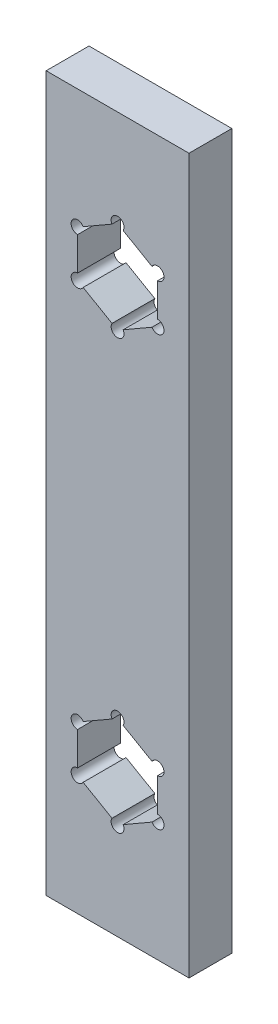
ISO-10303-21;
HEADER;
FILE_DESCRIPTION(('STEP AP214'),'2;1');
FILE_NAME('part.step','',(''),(''),'','','');
FILE_SCHEMA(('AUTOMOTIVE_DESIGN { 1 0 10303 214 1 1 1 1 }'));
ENDSEC;
DATA;
#1=APPLICATION_CONTEXT('core data for automotive mechanical design processes');
#2=APPLICATION_PROTOCOL_DEFINITION('international standard','automotive_design',2000,#1);
#3=PRODUCT_CONTEXT('',#1,'mechanical');
#4=PRODUCT('Part','Part','',(#3));
#5=PRODUCT_RELATED_PRODUCT_CATEGORY('part','',(#4));
#6=PRODUCT_DEFINITION_FORMATION('','',#4);
#7=PRODUCT_DEFINITION_CONTEXT('part definition',#1,'design');
#8=PRODUCT_DEFINITION('design','',#6,#7);
#9=PRODUCT_DEFINITION_SHAPE('','',#8);
#10=(LENGTH_UNIT() NAMED_UNIT(*) SI_UNIT(.MILLI.,.METRE.));
#11=(NAMED_UNIT(*) PLANE_ANGLE_UNIT() SI_UNIT($,.RADIAN.));
#12=(NAMED_UNIT(*) SI_UNIT($,.STERADIAN.) SOLID_ANGLE_UNIT());
#13=UNCERTAINTY_MEASURE_WITH_UNIT(LENGTH_MEASURE(1.E-05),#10,'distance_accuracy_value','');
#14=(GEOMETRIC_REPRESENTATION_CONTEXT(3) GLOBAL_UNCERTAINTY_ASSIGNED_CONTEXT((#13)) GLOBAL_UNIT_ASSIGNED_CONTEXT((#10,
#11,#12)) REPRESENTATION_CONTEXT('',''));
#15=CARTESIAN_POINT('',(0.,0.,0.));
#16=DIRECTION('',(0.,0.,1.));
#17=DIRECTION('',(1.,0.,0.));
#18=AXIS2_PLACEMENT_3D('',#15,#16,#17);
#19=CARTESIAN_POINT('',(0.,0.,0.));
#20=DIRECTION('',(0.,1.,0.));
#21=DIRECTION('',(1.,0.,0.));
#22=AXIS2_PLACEMENT_3D('',#19,#20,#21);
#23=PLANE('',#22);
#24=DIRECTION('',(0.,0.,1.));
#25=VECTOR('',#24,1.);
#26=CARTESIAN_POINT('',(10.,0.,0.));
#27=LINE('',#26,#25);
#28=CARTESIAN_POINT('',(10.,0.,0.));
#29=VERTEX_POINT('',#28);
#30=CARTESIAN_POINT('',(10.,0.,3.));
#31=VERTEX_POINT('',#30);
#32=EDGE_CURVE('E365',#29,#31,#27,.T.);
#33=ORIENTED_EDGE('',*,*,#32,.T.);
#34=DIRECTION('',(1.,0.,0.));
#35=VECTOR('',#34,1.);
#36=CARTESIAN_POINT('',(0.,0.,3.));
#37=LINE('',#36,#35);
#38=CARTESIAN_POINT('',(0.,0.,3.));
#39=VERTEX_POINT('',#38);
#40=EDGE_CURVE('E9',#39,#31,#37,.T.);
#41=ORIENTED_EDGE('',*,*,#40,.F.);
#42=DIRECTION('',(0.,0.,1.));
#43=VECTOR('',#42,1.);
#44=CARTESIAN_POINT('',(0.,0.,0.));
#45=LINE('',#44,#43);
#46=CARTESIAN_POINT('',(0.,0.,0.));
#47=VERTEX_POINT('',#46);
#48=EDGE_CURVE('E523',#47,#39,#45,.T.);
#49=ORIENTED_EDGE('',*,*,#48,.F.);
#50=DIRECTION('',(1.,0.,0.));
#51=VECTOR('',#50,1.);
#52=CARTESIAN_POINT('',(0.,0.,0.));
#53=LINE('',#52,#51);
#54=EDGE_CURVE('E395',#47,#29,#53,.T.);
#55=ORIENTED_EDGE('',*,*,#54,.T.);
#56=EDGE_LOOP('',(#33,#41,#49,#55));
#57=FACE_BOUND('',#56,.T.);
#58=ADVANCED_FACE('F15',(#57),#23,.F.);
#59=CARTESIAN_POINT('',(0.,0.,3.));
#60=DIRECTION('',(0.,0.,1.));
#61=DIRECTION('',(1.,0.,0.));
#62=AXIS2_PLACEMENT_3D('',#59,#60,#61);
#63=PLANE('',#62);
#64=DIRECTION('',(0.866025403784329,-0.50000000000019,0.));
#65=VECTOR('',#64,1.);
#66=CARTESIAN_POINT('',(13.885254037844,38.103257696894,3.));
#67=LINE('',#66,#65);
#68=CARTESIAN_POINT('',(5.389711431703,43.008161507462,3.));
#69=VERTEX_POINT('',#68);
#70=CARTESIAN_POINT('',(7.410288568297,41.841580753731,3.));
#71=VERTEX_POINT('',#70);
#72=EDGE_CURVE('E457',#69,#71,#67,.T.);
#73=ORIENTED_EDGE('',*,*,#72,.T.);
#74=CARTESIAN_POINT('',(7.8,41.616580753731,3.));
#75=DIRECTION('',(0.,0.,-1.));
#76=DIRECTION('',(-0.866025403784329,0.50000000000019,0.));
#77=AXIS2_PLACEMENT_3D('',#74,#75,#76);
#78=CIRCLE('',#77,0.45);
#79=CARTESIAN_POINT('',(7.8,41.166580753731,3.));
#80=VERTEX_POINT('',#79);
#81=EDGE_CURVE('E315',#71,#80,#78,.T.);
#82=ORIENTED_EDGE('',*,*,#81,.T.);
#83=DIRECTION('',(0.,-1.,0.));
#84=VECTOR('',#83,1.);
#85=CARTESIAN_POINT('',(7.8,19.191709623135,3.));
#86=LINE('',#85,#84);
#87=CARTESIAN_POINT('',(7.8,38.833419246269,3.));
#88=VERTEX_POINT('',#87);
#89=EDGE_CURVE('E316',#80,#88,#86,.T.);
#90=ORIENTED_EDGE('',*,*,#89,.T.);
#91=CARTESIAN_POINT('',(7.8,38.383419246269,3.));
#92=DIRECTION('',(0.,0.,-1.));
#93=DIRECTION('',(0.,1.,0.));
#94=AXIS2_PLACEMENT_3D('',#91,#92,#93);
#95=CIRCLE('',#94,0.45);
#96=CARTESIAN_POINT('',(7.410288568297,38.158419246269,3.));
#97=VERTEX_POINT('',#96);
#98=EDGE_CURVE('E307',#88,#97,#95,.T.);
#99=ORIENTED_EDGE('',*,*,#98,.T.);
#100=DIRECTION('',(-0.866025403784329,-0.50000000000019,0.));
#101=VECTOR('',#100,1.);
#102=CARTESIAN_POINT('',(-4.835254037844,31.08845192624,3.));
#103=LINE('',#102,#101);
#104=CARTESIAN_POINT('',(5.389711431703,36.991838492538,3.));
#105=VERTEX_POINT('',#104);
#106=EDGE_CURVE('E311',#97,#105,#103,.T.);
#107=ORIENTED_EDGE('',*,*,#106,.T.);
#108=CARTESIAN_POINT('',(5.,36.766838492538,3.));
#109=DIRECTION('',(0.,0.,-1.));
#110=DIRECTION('',(0.866025403784329,0.50000000000019,0.));
#111=AXIS2_PLACEMENT_3D('',#108,#109,#110);
#112=CIRCLE('',#111,0.45);
#113=CARTESIAN_POINT('',(4.610288568297,36.991838492538,3.));
#114=VERTEX_POINT('',#113);
#115=EDGE_CURVE('E267',#105,#114,#112,.T.);
#116=ORIENTED_EDGE('',*,*,#115,.T.);
#117=DIRECTION('',(-0.866025403784329,0.50000000000019,0.));
#118=VECTOR('',#117,1.);
#119=CARTESIAN_POINT('',(9.685254037844,34.061805812567,3.));
#120=LINE('',#119,#118);
#121=CARTESIAN_POINT('',(2.589711431703,38.158419246269,3.));
#122=VERTEX_POINT('',#121);
#123=EDGE_CURVE('E258',#114,#122,#120,.T.);
#124=ORIENTED_EDGE('',*,*,#123,.T.);
#125=CARTESIAN_POINT('',(2.2,38.383419246269,3.));
#126=DIRECTION('',(0.,0.,-1.));
#127=DIRECTION('',(1.,0.,0.));
#128=AXIS2_PLACEMENT_3D('',#125,#126,#127);
#129=CIRCLE('',#128,0.45);
#130=CARTESIAN_POINT('',(2.2,38.83341924627,3.));
#131=VERTEX_POINT('',#130);
#132=EDGE_CURVE('E264',#122,#131,#129,.T.);
#133=ORIENTED_EDGE('',*,*,#132,.T.);
#134=DIRECTION('',(0.,1.,0.));
#135=VECTOR('',#134,1.);
#136=CARTESIAN_POINT('',(2.2,20.808290376865,3.));
#137=LINE('',#136,#135);
#138=CARTESIAN_POINT('',(2.2,41.166580753731,3.));
#139=VERTEX_POINT('',#138);
#140=EDGE_CURVE('E287',#131,#139,#137,.T.);
#141=ORIENTED_EDGE('',*,*,#140,.T.);
#142=CARTESIAN_POINT('',(2.2,41.616580753731,3.));
#143=DIRECTION('',(0.,0.,-1.));
#144=DIRECTION('',(1.,0.,0.));
#145=AXIS2_PLACEMENT_3D('',#142,#143,#144);
#146=CIRCLE('',#145,0.45);
#147=CARTESIAN_POINT('',(2.589711431703,41.841580753731,3.));
#148=VERTEX_POINT('',#147);
#149=EDGE_CURVE('E434',#139,#148,#146,.T.);
#150=ORIENTED_EDGE('',*,*,#149,.T.);
#151=DIRECTION('',(0.866025403784329,0.50000000000019,0.));
#152=VECTOR('',#151,1.);
#153=CARTESIAN_POINT('',(-6.235254037844,36.746484564299,3.));
#154=LINE('',#153,#152);
#155=CARTESIAN_POINT('',(4.610288568297,43.008161507462,3.));
#156=VERTEX_POINT('',#155);
#157=EDGE_CURVE('E496',#148,#156,#154,.T.);
#158=ORIENTED_EDGE('',*,*,#157,.T.);
#159=CARTESIAN_POINT('',(5.,43.233161507462,3.));
#160=DIRECTION('',(0.,0.,-1.));
#161=DIRECTION('',(-0.866025403784329,-0.50000000000019,0.));
#162=AXIS2_PLACEMENT_3D('',#159,#160,#161);
#163=CIRCLE('',#162,0.45);
#164=EDGE_CURVE('E453',#156,#69,#163,.T.);
#165=ORIENTED_EDGE('',*,*,#164,.T.);
#166=EDGE_LOOP('',(#73,#82,#90,#99,#107,#116,#124,#133,#141,#150,#158,#165));
#167=FACE_BOUND('',#166,.T.);
#168=DIRECTION('',(0.866025403784329,-0.50000000000019,0.));
#169=VECTOR('',#168,1.);
#170=CARTESIAN_POINT('',(7.390063509461,11.853257696894,3.));
#171=LINE('',#170,#169);
#172=CARTESIAN_POINT('',(5.389711431703,13.008161507462,3.));
#173=VERTEX_POINT('',#172);
#174=CARTESIAN_POINT('',(7.410288568297,11.841580753731,3.));
#175=VERTEX_POINT('',#174);
#176=EDGE_CURVE('E323',#173,#175,#171,.T.);
#177=ORIENTED_EDGE('',*,*,#176,.T.);
#178=CARTESIAN_POINT('',(7.8,11.616580753731,3.));
#179=DIRECTION('',(0.,0.,-1.));
#180=DIRECTION('',(-0.866025403784329,0.50000000000019,0.));
#181=AXIS2_PLACEMENT_3D('',#178,#179,#180);
#182=CIRCLE('',#181,0.45);
#183=CARTESIAN_POINT('',(7.8,11.166580753731,3.));
#184=VERTEX_POINT('',#183);
#185=EDGE_CURVE('E370',#175,#184,#182,.T.);
#186=ORIENTED_EDGE('',*,*,#185,.T.);
#187=DIRECTION('',(0.,-1.,0.));
#188=VECTOR('',#187,1.);
#189=CARTESIAN_POINT('',(7.8,4.191709623135,3.));
#190=LINE('',#189,#188);
#191=CARTESIAN_POINT('',(7.8,8.833419246269,3.));
#192=VERTEX_POINT('',#191);
#193=EDGE_CURVE('E364',#184,#192,#190,.T.);
#194=ORIENTED_EDGE('',*,*,#193,.T.);
#195=CARTESIAN_POINT('',(7.8,8.383419246269,3.));
#196=DIRECTION('',(0.,0.,-1.));
#197=DIRECTION('',(0.,1.,0.));
#198=AXIS2_PLACEMENT_3D('',#195,#196,#197);
#199=CIRCLE('',#198,0.45);
#200=CARTESIAN_POINT('',(7.410288568297,8.158419246269,3.));
#201=VERTEX_POINT('',#200);
#202=EDGE_CURVE('E359',#192,#201,#199,.T.);
#203=ORIENTED_EDGE('',*,*,#202,.T.);
#204=DIRECTION('',(-0.866025403784329,-0.50000000000019,0.));
#205=VECTOR('',#204,1.);
#206=CARTESIAN_POINT('',(1.659936490539,4.83845192624,3.));
#207=LINE('',#206,#205);
#208=CARTESIAN_POINT('',(5.389711431703,6.991838492538,3.));
#209=VERTEX_POINT('',#208);
#210=EDGE_CURVE('E356',#201,#209,#207,.T.);
#211=ORIENTED_EDGE('',*,*,#210,.T.);
#212=CARTESIAN_POINT('',(5.,6.766838492538,3.));
#213=DIRECTION('',(0.,0.,-1.));
#214=DIRECTION('',(0.866025403784329,0.50000000000019,0.));
#215=AXIS2_PLACEMENT_3D('',#212,#213,#214);
#216=CIRCLE('',#215,0.45);
#217=CARTESIAN_POINT('',(4.610288568297,6.991838492538,3.));
#218=VERTEX_POINT('',#217);
#219=EDGE_CURVE('E352',#209,#218,#216,.T.);
#220=ORIENTED_EDGE('',*,*,#219,.T.);
#221=DIRECTION('',(-0.866025403784329,0.50000000000019,0.));
#222=VECTOR('',#221,1.);
#223=CARTESIAN_POINT('',(3.190063509461,7.811805812567,3.));
#224=LINE('',#223,#222);
#225=CARTESIAN_POINT('',(2.589711431703,8.158419246269,3.));
#226=VERTEX_POINT('',#225);
#227=EDGE_CURVE('E302',#218,#226,#224,.T.);
#228=ORIENTED_EDGE('',*,*,#227,.T.);
#229=CARTESIAN_POINT('',(2.2,8.383419246269,3.));
#230=DIRECTION('',(0.,0.,-1.));
#231=DIRECTION('',(1.,0.,0.));
#232=AXIS2_PLACEMENT_3D('',#229,#230,#231);
#233=CIRCLE('',#232,0.45);
#234=CARTESIAN_POINT('',(2.2,8.833419246269,3.));
#235=VERTEX_POINT('',#234);
#236=EDGE_CURVE('E347',#226,#235,#233,.T.);
#237=ORIENTED_EDGE('',*,*,#236,.T.);
#238=DIRECTION('',(0.,1.,0.));
#239=VECTOR('',#238,1.);
#240=CARTESIAN_POINT('',(2.2,5.808290376865,3.));
#241=LINE('',#240,#239);
#242=CARTESIAN_POINT('',(2.2,11.166580753731,3.));
#243=VERTEX_POINT('',#242);
#244=EDGE_CURVE('E343',#235,#243,#241,.T.);
#245=ORIENTED_EDGE('',*,*,#244,.T.);
#246=CARTESIAN_POINT('',(2.2,11.616580753731,3.));
#247=DIRECTION('',(0.,0.,-1.));
#248=DIRECTION('',(1.,0.,0.));
#249=AXIS2_PLACEMENT_3D('',#246,#247,#248);
#250=CIRCLE('',#249,0.45);
#251=CARTESIAN_POINT('',(2.589711431703,11.841580753731,3.));
#252=VERTEX_POINT('',#251);
#253=EDGE_CURVE('E344',#243,#252,#250,.T.);
#254=ORIENTED_EDGE('',*,*,#253,.T.);
#255=DIRECTION('',(0.866025403784329,0.50000000000019,0.));
#256=VECTOR('',#255,1.);
#257=CARTESIAN_POINT('',(0.259936490539,10.496484564299,3.));
#258=LINE('',#257,#256);
#259=CARTESIAN_POINT('',(4.610288568297,13.008161507462,3.));
#260=VERTEX_POINT('',#259);
#261=EDGE_CURVE('E336',#252,#260,#258,.T.);
#262=ORIENTED_EDGE('',*,*,#261,.T.);
#263=CARTESIAN_POINT('',(5.,13.233161507462,3.));
#264=DIRECTION('',(0.,0.,-1.));
#265=DIRECTION('',(-0.866025403784329,-0.50000000000019,0.));
#266=AXIS2_PLACEMENT_3D('',#263,#264,#265);
#267=CIRCLE('',#266,0.45);
#268=EDGE_CURVE('E327',#260,#173,#267,.T.);
#269=ORIENTED_EDGE('',*,*,#268,.T.);
#270=EDGE_LOOP('',(#177,#186,#194,#203,#211,#220,#228,#237,#245,#254,#262,#269));
#271=FACE_BOUND('',#270,.T.);
#272=DIRECTION('',(0.,1.,0.));
#273=VECTOR('',#272,1.);
#274=CARTESIAN_POINT('',(0.,0.,3.));
#275=LINE('',#274,#273);
#276=CARTESIAN_POINT('',(0.,50.,3.));
#277=VERTEX_POINT('',#276);
#278=EDGE_CURVE('E557',#39,#277,#275,.T.);
#279=ORIENTED_EDGE('',*,*,#278,.F.);
#280=ORIENTED_EDGE('',*,*,#40,.T.);
#281=DIRECTION('',(0.,1.,0.));
#282=VECTOR('',#281,1.);
#283=CARTESIAN_POINT('',(10.,0.,3.));
#284=LINE('',#283,#282);
#285=CARTESIAN_POINT('',(10.,50.,3.));
#286=VERTEX_POINT('',#285);
#287=EDGE_CURVE('E373',#31,#286,#284,.T.);
#288=ORIENTED_EDGE('',*,*,#287,.T.);
#289=DIRECTION('',(1.,0.,0.));
#290=VECTOR('',#289,1.);
#291=CARTESIAN_POINT('',(0.,50.,3.));
#292=LINE('',#291,#290);
#293=EDGE_CURVE('E23',#277,#286,#292,.T.);
#294=ORIENTED_EDGE('',*,*,#293,.F.);
#295=EDGE_LOOP('',(#279,#280,#288,#294));
#296=FACE_BOUND('',#295,.T.);
#297=ADVANCED_FACE('F261',(#167,#271,#296),#63,.T.);
#298=CARTESIAN_POINT('',(0.,50.,0.));
#299=DIRECTION('',(0.,1.,0.));
#300=DIRECTION('',(1.,0.,0.));
#301=AXIS2_PLACEMENT_3D('',#298,#299,#300);
#302=PLANE('',#301);
#303=DIRECTION('',(1.,0.,0.));
#304=VECTOR('',#303,1.);
#305=CARTESIAN_POINT('',(0.,50.,0.));
#306=LINE('',#305,#304);
#307=CARTESIAN_POINT('',(0.,50.,0.));
#308=VERTEX_POINT('',#307);
#309=CARTESIAN_POINT('',(10.,50.,0.));
#310=VERTEX_POINT('',#309);
#311=EDGE_CURVE('E526',#308,#310,#306,.T.);
#312=ORIENTED_EDGE('',*,*,#311,.F.);
#313=DIRECTION('',(0.,0.,1.));
#314=VECTOR('',#313,1.);
#315=CARTESIAN_POINT('',(0.,50.,0.));
#316=LINE('',#315,#314);
#317=EDGE_CURVE('E560',#308,#277,#316,.T.);
#318=ORIENTED_EDGE('',*,*,#317,.T.);
#319=ORIENTED_EDGE('',*,*,#293,.T.);
#320=DIRECTION('',(0.,0.,1.));
#321=VECTOR('',#320,1.);
#322=CARTESIAN_POINT('',(10.,50.,0.));
#323=LINE('',#322,#321);
#324=EDGE_CURVE('E369',#310,#286,#323,.T.);
#325=ORIENTED_EDGE('',*,*,#324,.F.);
#326=EDGE_LOOP('',(#312,#318,#319,#325));
#327=FACE_BOUND('',#326,.T.);
#328=ADVANCED_FACE('F632',(#327),#302,.T.);
#329=CARTESIAN_POINT('',(10.,0.,0.));
#330=DIRECTION('',(1.,0.,0.));
#331=DIRECTION('',(0.,1.,0.));
#332=AXIS2_PLACEMENT_3D('',#329,#330,#331);
#333=PLANE('',#332);
#334=ORIENTED_EDGE('',*,*,#32,.F.);
#335=DIRECTION('',(0.,1.,0.));
#336=VECTOR('',#335,1.);
#337=CARTESIAN_POINT('',(10.,0.,0.));
#338=LINE('',#337,#336);
#339=EDGE_CURVE('E383',#29,#310,#338,.T.);
#340=ORIENTED_EDGE('',*,*,#339,.T.);
#341=ORIENTED_EDGE('',*,*,#324,.T.);
#342=ORIENTED_EDGE('',*,*,#287,.F.);
#343=EDGE_LOOP('',(#334,#340,#341,#342));
#344=FACE_BOUND('',#343,.T.);
#345=ADVANCED_FACE('F642',(#344),#333,.T.);
#346=CARTESIAN_POINT('',(7.8,11.616580753731,-1.));
#347=DIRECTION('',(0.,0.,-1.));
#348=DIRECTION('',(1.,0.,0.));
#349=AXIS2_PLACEMENT_3D('',#346,#347,#348);
#350=CYLINDRICAL_SURFACE('',#349,0.45);
#351=ORIENTED_EDGE('',*,*,#185,.F.);
#352=DIRECTION('',(0.,0.,-1.));
#353=VECTOR('',#352,1.);
#354=CARTESIAN_POINT('',(7.410288568297,11.841580753731,-1.));
#355=LINE('',#354,#353);
#356=CARTESIAN_POINT('',(7.410288568297,11.841580753731,0.));
#357=VERTEX_POINT('',#356);
#358=EDGE_CURVE('E320',#175,#357,#355,.T.);
#359=ORIENTED_EDGE('',*,*,#358,.T.);
#360=CARTESIAN_POINT('',(7.8,11.616580753731,0.));
#361=DIRECTION('',(0.,0.,1.));
#362=DIRECTION('',(0.,-1.,0.));
#363=AXIS2_PLACEMENT_3D('',#360,#361,#362);
#364=CIRCLE('',#363,0.45);
#365=CARTESIAN_POINT('',(7.8,11.166580753731,0.));
#366=VERTEX_POINT('',#365);
#367=EDGE_CURVE('E430',#366,#357,#364,.T.);
#368=ORIENTED_EDGE('',*,*,#367,.F.);
#369=DIRECTION('',(0.,0.,-1.));
#370=VECTOR('',#369,1.);
#371=CARTESIAN_POINT('',(7.8,11.166580753731,-1.));
#372=LINE('',#371,#370);
#373=EDGE_CURVE('E386',#184,#366,#372,.T.);
#374=ORIENTED_EDGE('',*,*,#373,.F.);
#375=EDGE_LOOP('',(#351,#359,#368,#374));
#376=FACE_BOUND('',#375,.T.);
#377=ADVANCED_FACE('F626',(#376),#350,.F.);
#378=CARTESIAN_POINT('',(7.8,8.383419246269,-1.));
#379=DIRECTION('',(-1.,0.,0.));
#380=DIRECTION('',(0.,0.,1.));
#381=AXIS2_PLACEMENT_3D('',#378,#379,#380);
#382=PLANE('',#381);
#383=ORIENTED_EDGE('',*,*,#193,.F.);
#384=ORIENTED_EDGE('',*,*,#373,.T.);
#385=DIRECTION('',(0.,-1.,0.));
#386=VECTOR('',#385,1.);
#387=CARTESIAN_POINT('',(7.8,4.191709623135,0.));
#388=LINE('',#387,#386);
#389=CARTESIAN_POINT('',(7.8,8.833419246269,0.));
#390=VERTEX_POINT('',#389);
#391=EDGE_CURVE('E419',#366,#390,#388,.T.);
#392=ORIENTED_EDGE('',*,*,#391,.T.);
#393=DIRECTION('',(0.,0.,-1.));
#394=VECTOR('',#393,1.);
#395=CARTESIAN_POINT('',(7.8,8.833419246269,-1.));
#396=LINE('',#395,#394);
#397=EDGE_CURVE('E361',#192,#390,#396,.T.);
#398=ORIENTED_EDGE('',*,*,#397,.F.);
#399=EDGE_LOOP('',(#383,#384,#392,#398));
#400=FACE_BOUND('',#399,.T.);
#401=ADVANCED_FACE('F622',(#400),#382,.T.);
#402=CARTESIAN_POINT('',(7.8,8.383419246269,-1.));
#403=DIRECTION('',(0.,0.,-1.));
#404=DIRECTION('',(1.,0.,0.));
#405=AXIS2_PLACEMENT_3D('',#402,#403,#404);
#406=CYLINDRICAL_SURFACE('',#405,0.45);
#407=ORIENTED_EDGE('',*,*,#202,.F.);
#408=ORIENTED_EDGE('',*,*,#397,.T.);
#409=CARTESIAN_POINT('',(7.8,8.383419246269,0.));
#410=DIRECTION('',(0.,0.,1.));
#411=DIRECTION('',(-0.866025403784329,-0.50000000000019,0.));
#412=AXIS2_PLACEMENT_3D('',#409,#410,#411);
#413=CIRCLE('',#412,0.45);
#414=CARTESIAN_POINT('',(7.410288568297,8.158419246269,0.));
#415=VERTEX_POINT('',#414);
#416=EDGE_CURVE('E415',#415,#390,#413,.T.);
#417=ORIENTED_EDGE('',*,*,#416,.F.);
#418=DIRECTION('',(0.,0.,-1.));
#419=VECTOR('',#418,1.);
#420=CARTESIAN_POINT('',(7.410288568297,8.158419246269,-1.));
#421=LINE('',#420,#419);
#422=EDGE_CURVE('E360',#201,#415,#421,.T.);
#423=ORIENTED_EDGE('',*,*,#422,.F.);
#424=EDGE_LOOP('',(#407,#408,#417,#423));
#425=FACE_BOUND('',#424,.T.);
#426=ADVANCED_FACE('F618',(#425),#406,.F.);
#427=CARTESIAN_POINT('',(5.,6.766838492538,-1.));
#428=DIRECTION('',(-0.50000000000019,0.866025403784329,0.));
#429=DIRECTION('',(0.,0.,1.));
#430=AXIS2_PLACEMENT_3D('',#427,#428,#429);
#431=PLANE('',#430);
#432=ORIENTED_EDGE('',*,*,#422,.T.);
#433=DIRECTION('',(-0.866025403784329,-0.50000000000019,0.));
#434=VECTOR('',#433,1.);
#435=CARTESIAN_POINT('',(1.659936490539,4.83845192624,0.));
#436=LINE('',#435,#434);
#437=CARTESIAN_POINT('',(5.389711431703,6.991838492538,0.));
#438=VERTEX_POINT('',#437);
#439=EDGE_CURVE('E420',#415,#438,#436,.T.);
#440=ORIENTED_EDGE('',*,*,#439,.T.);
#441=DIRECTION('',(0.,0.,-1.));
#442=VECTOR('',#441,1.);
#443=CARTESIAN_POINT('',(5.389711431703,6.991838492538,-1.));
#444=LINE('',#443,#442);
#445=EDGE_CURVE('E355',#209,#438,#444,.T.);
#446=ORIENTED_EDGE('',*,*,#445,.F.);
#447=ORIENTED_EDGE('',*,*,#210,.F.);
#448=EDGE_LOOP('',(#432,#440,#446,#447));
#449=FACE_BOUND('',#448,.T.);
#450=ADVANCED_FACE('F612',(#449),#431,.T.);
#451=CARTESIAN_POINT('',(5.,6.766838492538,-1.));
#452=DIRECTION('',(0.,0.,-1.));
#453=DIRECTION('',(1.,0.,0.));
#454=AXIS2_PLACEMENT_3D('',#451,#452,#453);
#455=CYLINDRICAL_SURFACE('',#454,0.45);
#456=ORIENTED_EDGE('',*,*,#219,.F.);
#457=ORIENTED_EDGE('',*,*,#445,.T.);
#458=CARTESIAN_POINT('',(5.,6.766838492538,0.));
#459=DIRECTION('',(0.,0.,1.));
#460=DIRECTION('',(-0.866025403784329,0.50000000000019,0.));
#461=AXIS2_PLACEMENT_3D('',#458,#459,#460);
#462=CIRCLE('',#461,0.45);
#463=CARTESIAN_POINT('',(4.610288568297,6.991838492538,0.));
#464=VERTEX_POINT('',#463);
#465=EDGE_CURVE('E534',#464,#438,#462,.T.);
#466=ORIENTED_EDGE('',*,*,#465,.F.);
#467=DIRECTION('',(0.,0.,-1.));
#468=VECTOR('',#467,1.);
#469=CARTESIAN_POINT('',(4.610288568297,6.991838492538,-1.));
#470=LINE('',#469,#468);
#471=EDGE_CURVE('E299',#218,#464,#470,.T.);
#472=ORIENTED_EDGE('',*,*,#471,.F.);
#473=EDGE_LOOP('',(#456,#457,#466,#472));
#474=FACE_BOUND('',#473,.T.);
#475=ADVANCED_FACE('F608',(#474),#455,.F.);
#476=CARTESIAN_POINT('',(2.2,8.383419246269,-1.));
#477=DIRECTION('',(0.50000000000019,0.866025403784329,0.));
#478=DIRECTION('',(0.,0.,-1.));
#479=AXIS2_PLACEMENT_3D('',#476,#477,#478);
#480=PLANE('',#479);
#481=ORIENTED_EDGE('',*,*,#471,.T.);
#482=DIRECTION('',(-0.866025403784329,0.50000000000019,0.));
#483=VECTOR('',#482,1.);
#484=CARTESIAN_POINT('',(3.190063509461,7.811805812567,0.));
#485=LINE('',#484,#483);
#486=CARTESIAN_POINT('',(2.589711431703,8.158419246269,0.));
#487=VERTEX_POINT('',#486);
#488=EDGE_CURVE('E413',#464,#487,#485,.T.);
#489=ORIENTED_EDGE('',*,*,#488,.T.);
#490=DIRECTION('',(0.,0.,-1.));
#491=VECTOR('',#490,1.);
#492=CARTESIAN_POINT('',(2.589711431703,8.158419246269,-1.));
#493=LINE('',#492,#491);
#494=EDGE_CURVE('E303',#226,#487,#493,.T.);
#495=ORIENTED_EDGE('',*,*,#494,.F.);
#496=ORIENTED_EDGE('',*,*,#227,.F.);
#497=EDGE_LOOP('',(#481,#489,#495,#496));
#498=FACE_BOUND('',#497,.T.);
#499=ADVANCED_FACE('F603',(#498),#480,.T.);
#500=CARTESIAN_POINT('',(2.2,8.383419246269,-1.));
#501=DIRECTION('',(0.,0.,-1.));
#502=DIRECTION('',(1.,0.,0.));
#503=AXIS2_PLACEMENT_3D('',#500,#501,#502);
#504=CYLINDRICAL_SURFACE('',#503,0.45);
#505=ORIENTED_EDGE('',*,*,#236,.F.);
#506=ORIENTED_EDGE('',*,*,#494,.T.);
#507=CARTESIAN_POINT('',(2.2,8.383419246269,0.));
#508=DIRECTION('',(0.,0.,-1.));
#509=DIRECTION('',(1.,0.,0.));
#510=AXIS2_PLACEMENT_3D('',#507,#508,#509);
#511=CIRCLE('',#510,0.45);
#512=CARTESIAN_POINT('',(2.2,8.833419246269,0.));
#513=VERTEX_POINT('',#512);
#514=EDGE_CURVE('E409',#487,#513,#511,.T.);
#515=ORIENTED_EDGE('',*,*,#514,.T.);
#516=DIRECTION('',(0.,0.,-1.));
#517=VECTOR('',#516,1.);
#518=CARTESIAN_POINT('',(2.2,8.833419246269,-1.));
#519=LINE('',#518,#517);
#520=EDGE_CURVE('E340',#235,#513,#519,.T.);
#521=ORIENTED_EDGE('',*,*,#520,.F.);
#522=EDGE_LOOP('',(#505,#506,#515,#521));
#523=FACE_BOUND('',#522,.T.);
#524=ADVANCED_FACE('F596',(#523),#504,.F.);
#525=CARTESIAN_POINT('',(2.2,11.616580753731,-1.));
#526=DIRECTION('',(1.,0.,0.));
#527=DIRECTION('',(0.,1.,0.));
#528=AXIS2_PLACEMENT_3D('',#525,#526,#527);
#529=PLANE('',#528);
#530=ORIENTED_EDGE('',*,*,#520,.T.);
#531=DIRECTION('',(0.,1.,0.));
#532=VECTOR('',#531,1.);
#533=CARTESIAN_POINT('',(2.2,5.808290376865,0.));
#534=LINE('',#533,#532);
#535=CARTESIAN_POINT('',(2.2,11.166580753731,0.));
#536=VERTEX_POINT('',#535);
#537=EDGE_CURVE('E414',#513,#536,#534,.T.);
#538=ORIENTED_EDGE('',*,*,#537,.T.);
#539=DIRECTION('',(0.,0.,-1.));
#540=VECTOR('',#539,1.);
#541=CARTESIAN_POINT('',(2.2,11.166580753731,-1.));
#542=LINE('',#541,#540);
#543=EDGE_CURVE('E339',#243,#536,#542,.T.);
#544=ORIENTED_EDGE('',*,*,#543,.F.);
#545=ORIENTED_EDGE('',*,*,#244,.F.);
#546=EDGE_LOOP('',(#530,#538,#544,#545));
#547=FACE_BOUND('',#546,.T.);
#548=ADVANCED_FACE('F592',(#547),#529,.T.);
#549=CARTESIAN_POINT('',(2.2,11.616580753731,-1.));
#550=DIRECTION('',(0.,0.,-1.));
#551=DIRECTION('',(1.,0.,0.));
#552=AXIS2_PLACEMENT_3D('',#549,#550,#551);
#553=CYLINDRICAL_SURFACE('',#552,0.45);
#554=ORIENTED_EDGE('',*,*,#543,.T.);
#555=CARTESIAN_POINT('',(2.2,11.616580753731,0.));
#556=DIRECTION('',(0.,0.,-1.));
#557=DIRECTION('',(1.,0.,0.));
#558=AXIS2_PLACEMENT_3D('',#555,#556,#557);
#559=CIRCLE('',#558,0.45);
#560=CARTESIAN_POINT('',(2.589711431703,11.841580753731,0.));
#561=VERTEX_POINT('',#560);
#562=EDGE_CURVE('E393',#536,#561,#559,.T.);
#563=ORIENTED_EDGE('',*,*,#562,.T.);
#564=DIRECTION('',(0.,0.,-1.));
#565=VECTOR('',#564,1.);
#566=CARTESIAN_POINT('',(2.589711431703,11.841580753731,-1.));
#567=LINE('',#566,#565);
#568=EDGE_CURVE('E333',#252,#561,#567,.T.);
#569=ORIENTED_EDGE('',*,*,#568,.F.);
#570=ORIENTED_EDGE('',*,*,#253,.F.);
#571=EDGE_LOOP('',(#554,#563,#569,#570));
#572=FACE_BOUND('',#571,.T.);
#573=ADVANCED_FACE('F590',(#572),#553,.F.);
#574=CARTESIAN_POINT('',(5.,13.233161507462,-1.));
#575=DIRECTION('',(0.50000000000019,-0.866025403784329,0.));
#576=DIRECTION('',(0.,0.,-1.));
#577=AXIS2_PLACEMENT_3D('',#574,#575,#576);
#578=PLANE('',#577);
#579=ORIENTED_EDGE('',*,*,#568,.T.);
#580=DIRECTION('',(0.866025403784329,0.50000000000019,0.));
#581=VECTOR('',#580,1.);
#582=CARTESIAN_POINT('',(0.259936490539,10.496484564299,0.));
#583=LINE('',#582,#581);
#584=CARTESIAN_POINT('',(4.610288568297,13.008161507462,0.));
#585=VERTEX_POINT('',#584);
#586=EDGE_CURVE('E389',#561,#585,#583,.T.);
#587=ORIENTED_EDGE('',*,*,#586,.T.);
#588=DIRECTION('',(0.,0.,-1.));
#589=VECTOR('',#588,1.);
#590=CARTESIAN_POINT('',(4.610288568297,13.008161507462,-1.));
#591=LINE('',#590,#589);
#592=EDGE_CURVE('E330',#260,#585,#591,.T.);
#593=ORIENTED_EDGE('',*,*,#592,.F.);
#594=ORIENTED_EDGE('',*,*,#261,.F.);
#595=EDGE_LOOP('',(#579,#587,#593,#594));
#596=FACE_BOUND('',#595,.T.);
#597=ADVANCED_FACE('F588',(#596),#578,.T.);
#598=CARTESIAN_POINT('',(5.,13.233161507462,-1.));
#599=DIRECTION('',(0.,0.,-1.));
#600=DIRECTION('',(1.,0.,0.));
#601=AXIS2_PLACEMENT_3D('',#598,#599,#600);
#602=CYLINDRICAL_SURFACE('',#601,0.45);
#603=ORIENTED_EDGE('',*,*,#268,.F.);
#604=ORIENTED_EDGE('',*,*,#592,.T.);
#605=CARTESIAN_POINT('',(5.,13.233161507462,0.));
#606=DIRECTION('',(0.,0.,1.));
#607=DIRECTION('',(0.866025403784329,-0.50000000000019,0.));
#608=AXIS2_PLACEMENT_3D('',#605,#606,#607);
#609=CIRCLE('',#608,0.45);
#610=CARTESIAN_POINT('',(5.389711431703,13.008161507462,0.));
#611=VERTEX_POINT('',#610);
#612=EDGE_CURVE('E394',#611,#585,#609,.T.);
#613=ORIENTED_EDGE('',*,*,#612,.F.);
#614=DIRECTION('',(0.,0.,-1.));
#615=VECTOR('',#614,1.);
#616=CARTESIAN_POINT('',(5.389711431703,13.008161507462,-1.));
#617=LINE('',#616,#615);
#618=EDGE_CURVE('E319',#173,#611,#617,.T.);
#619=ORIENTED_EDGE('',*,*,#618,.F.);
#620=EDGE_LOOP('',(#603,#604,#613,#619));
#621=FACE_BOUND('',#620,.T.);
#622=ADVANCED_FACE('F584',(#621),#602,.F.);
#623=CARTESIAN_POINT('',(7.8,11.616580753731,-1.));
#624=DIRECTION('',(-0.50000000000019,-0.866025403784329,0.));
#625=DIRECTION('',(-0.866025403784329,0.50000000000019,0.));
#626=AXIS2_PLACEMENT_3D('',#623,#624,#625);
#627=PLANE('',#626);
#628=ORIENTED_EDGE('',*,*,#618,.T.);
#629=DIRECTION('',(0.866025403784329,-0.50000000000019,0.));
#630=VECTOR('',#629,1.);
#631=CARTESIAN_POINT('',(7.390063509461,11.853257696894,0.));
#632=LINE('',#631,#630);
#633=EDGE_CURVE('E399',#611,#357,#632,.T.);
#634=ORIENTED_EDGE('',*,*,#633,.T.);
#635=ORIENTED_EDGE('',*,*,#358,.F.);
#636=ORIENTED_EDGE('',*,*,#176,.F.);
#637=EDGE_LOOP('',(#628,#634,#635,#636));
#638=FACE_BOUND('',#637,.T.);
#639=ADVANCED_FACE('F629',(#638),#627,.T.);
#640=CARTESIAN_POINT('',(7.8,41.616580753731,-1.));
#641=DIRECTION('',(0.,0.,-1.));
#642=DIRECTION('',(1.,0.,0.));
#643=AXIS2_PLACEMENT_3D('',#640,#641,#642);
#644=CYLINDRICAL_SURFACE('',#643,0.45);
#645=ORIENTED_EDGE('',*,*,#81,.F.);
#646=DIRECTION('',(0.,0.,-1.));
#647=VECTOR('',#646,1.);
#648=CARTESIAN_POINT('',(7.410288568297,41.841580753731,-1.));
#649=LINE('',#648,#647);
#650=CARTESIAN_POINT('',(7.410288568297,41.841580753731,0.));
#651=VERTEX_POINT('',#650);
#652=EDGE_CURVE('E486',#71,#651,#649,.T.);
#653=ORIENTED_EDGE('',*,*,#652,.T.);
#654=CARTESIAN_POINT('',(7.8,41.616580753731,0.));
#655=DIRECTION('',(0.,0.,1.));
#656=DIRECTION('',(0.,-1.,0.));
#657=AXIS2_PLACEMENT_3D('',#654,#655,#656);
#658=CIRCLE('',#657,0.45);
#659=CARTESIAN_POINT('',(7.8,41.166580753731,0.));
#660=VERTEX_POINT('',#659);
#661=EDGE_CURVE('E477',#660,#651,#658,.T.);
#662=ORIENTED_EDGE('',*,*,#661,.F.);
#663=DIRECTION('',(0.,0.,-1.));
#664=VECTOR('',#663,1.);
#665=CARTESIAN_POINT('',(7.8,41.166580753731,-1.));
#666=LINE('',#665,#664);
#667=EDGE_CURVE('E312',#80,#660,#666,.T.);
#668=ORIENTED_EDGE('',*,*,#667,.F.);
#669=EDGE_LOOP('',(#645,#653,#662,#668));
#670=FACE_BOUND('',#669,.T.);
#671=ADVANCED_FACE('F768',(#670),#644,.F.);
#672=CARTESIAN_POINT('',(7.8,38.383419246269,-1.));
#673=DIRECTION('',(-1.,0.,0.));
#674=DIRECTION('',(0.,0.,1.));
#675=AXIS2_PLACEMENT_3D('',#672,#673,#674);
#676=PLANE('',#675);
#677=ORIENTED_EDGE('',*,*,#89,.F.);
#678=ORIENTED_EDGE('',*,*,#667,.T.);
#679=DIRECTION('',(0.,-1.,0.));
#680=VECTOR('',#679,1.);
#681=CARTESIAN_POINT('',(7.8,19.191709623135,0.));
#682=LINE('',#681,#680);
#683=CARTESIAN_POINT('',(7.8,38.833419246269,0.));
#684=VERTEX_POINT('',#683);
#685=EDGE_CURVE('E473',#660,#684,#682,.T.);
#686=ORIENTED_EDGE('',*,*,#685,.T.);
#687=DIRECTION('',(0.,0.,-1.));
#688=VECTOR('',#687,1.);
#689=CARTESIAN_POINT('',(7.8,38.833419246269,-1.));
#690=LINE('',#689,#688);
#691=EDGE_CURVE('E310',#88,#684,#690,.T.);
#692=ORIENTED_EDGE('',*,*,#691,.F.);
#693=EDGE_LOOP('',(#677,#678,#686,#692));
#694=FACE_BOUND('',#693,.T.);
#695=ADVANCED_FACE('F776',(#694),#676,.T.);
#696=CARTESIAN_POINT('',(7.8,38.383419246269,-1.));
#697=DIRECTION('',(0.,0.,-1.));
#698=DIRECTION('',(1.,0.,0.));
#699=AXIS2_PLACEMENT_3D('',#696,#697,#698);
#700=CYLINDRICAL_SURFACE('',#699,0.45);
#701=ORIENTED_EDGE('',*,*,#98,.F.);
#702=ORIENTED_EDGE('',*,*,#691,.T.);
#703=CARTESIAN_POINT('',(7.8,38.383419246269,0.));
#704=DIRECTION('',(0.,0.,1.));
#705=DIRECTION('',(-0.866025403784329,-0.50000000000019,0.));
#706=AXIS2_PLACEMENT_3D('',#703,#704,#705);
#707=CIRCLE('',#706,0.45);
#708=CARTESIAN_POINT('',(7.410288568297,38.158419246269,0.));
#709=VERTEX_POINT('',#708);
#710=EDGE_CURVE('E472',#709,#684,#707,.T.);
#711=ORIENTED_EDGE('',*,*,#710,.F.);
#712=DIRECTION('',(0.,0.,-1.));
#713=VECTOR('',#712,1.);
#714=CARTESIAN_POINT('',(7.410288568297,38.158419246269,-1.));
#715=LINE('',#714,#713);
#716=EDGE_CURVE('E306',#97,#709,#715,.T.);
#717=ORIENTED_EDGE('',*,*,#716,.F.);
#718=EDGE_LOOP('',(#701,#702,#711,#717));
#719=FACE_BOUND('',#718,.T.);
#720=ADVANCED_FACE('F785',(#719),#700,.F.);
#721=CARTESIAN_POINT('',(5.,36.766838492538,-1.));
#722=DIRECTION('',(-0.50000000000019,0.866025403784329,0.));
#723=DIRECTION('',(0.,0.,1.));
#724=AXIS2_PLACEMENT_3D('',#721,#722,#723);
#725=PLANE('',#724);
#726=ORIENTED_EDGE('',*,*,#716,.T.);
#727=DIRECTION('',(-0.866025403784329,-0.50000000000019,0.));
#728=VECTOR('',#727,1.);
#729=CARTESIAN_POINT('',(-4.835254037844,31.08845192624,0.));
#730=LINE('',#729,#728);
#731=CARTESIAN_POINT('',(5.389711431703,36.991838492538,0.));
#732=VERTEX_POINT('',#731);
#733=EDGE_CURVE('E466',#709,#732,#730,.T.);
#734=ORIENTED_EDGE('',*,*,#733,.T.);
#735=DIRECTION('',(0.,0.,-1.));
#736=VECTOR('',#735,1.);
#737=CARTESIAN_POINT('',(5.389711431703,36.991838492538,-1.));
#738=LINE('',#737,#736);
#739=EDGE_CURVE('E298',#105,#732,#738,.T.);
#740=ORIENTED_EDGE('',*,*,#739,.F.);
#741=ORIENTED_EDGE('',*,*,#106,.F.);
#742=EDGE_LOOP('',(#726,#734,#740,#741));
#743=FACE_BOUND('',#742,.T.);
#744=ADVANCED_FACE('F794',(#743),#725,.T.);
#745=CARTESIAN_POINT('',(5.,36.766838492538,-1.));
#746=DIRECTION('',(0.,0.,-1.));
#747=DIRECTION('',(1.,0.,0.));
#748=AXIS2_PLACEMENT_3D('',#745,#746,#747);
#749=CYLINDRICAL_SURFACE('',#748,0.45);
#750=ORIENTED_EDGE('',*,*,#115,.F.);
#751=ORIENTED_EDGE('',*,*,#739,.T.);
#752=CARTESIAN_POINT('',(5.,36.766838492538,0.));
#753=DIRECTION('',(0.,0.,1.));
#754=DIRECTION('',(-0.866025403784329,0.50000000000019,0.));
#755=AXIS2_PLACEMENT_3D('',#752,#753,#754);
#756=CIRCLE('',#755,0.45);
#757=CARTESIAN_POINT('',(4.610288568297,36.991838492538,0.));
#758=VERTEX_POINT('',#757);
#759=EDGE_CURVE('E462',#758,#732,#756,.T.);
#760=ORIENTED_EDGE('',*,*,#759,.F.);
#761=DIRECTION('',(0.,0.,-1.));
#762=VECTOR('',#761,1.);
#763=CARTESIAN_POINT('',(4.610288568297,36.991838492538,-1.));
#764=LINE('',#763,#762);
#765=EDGE_CURVE('E271',#114,#758,#764,.T.);
#766=ORIENTED_EDGE('',*,*,#765,.F.);
#767=EDGE_LOOP('',(#750,#751,#760,#766));
#768=FACE_BOUND('',#767,.T.);
#769=ADVANCED_FACE('F803',(#768),#749,.F.);
#770=CARTESIAN_POINT('',(2.2,38.383419246269,-1.));
#771=DIRECTION('',(0.50000000000019,0.866025403784329,0.));
#772=DIRECTION('',(0.,0.,-1.));
#773=AXIS2_PLACEMENT_3D('',#770,#771,#772);
#774=PLANE('',#773);
#775=ORIENTED_EDGE('',*,*,#765,.T.);
#776=DIRECTION('',(-0.866025403784329,0.50000000000019,0.));
#777=VECTOR('',#776,1.);
#778=CARTESIAN_POINT('',(9.685254037844,34.061805812567,0.));
#779=LINE('',#778,#777);
#780=CARTESIAN_POINT('',(2.589711431703,38.158419246269,0.));
#781=VERTEX_POINT('',#780);
#782=EDGE_CURVE('E277',#758,#781,#779,.T.);
#783=ORIENTED_EDGE('',*,*,#782,.T.);
#784=DIRECTION('',(0.,0.,-1.));
#785=VECTOR('',#784,1.);
#786=CARTESIAN_POINT('',(2.589711431703,38.158419246269,-1.));
#787=LINE('',#786,#785);
#788=EDGE_CURVE('E274',#122,#781,#787,.T.);
#789=ORIENTED_EDGE('',*,*,#788,.F.);
#790=ORIENTED_EDGE('',*,*,#123,.F.);
#791=EDGE_LOOP('',(#775,#783,#789,#790));
#792=FACE_BOUND('',#791,.T.);
#793=ADVANCED_FACE('F275',(#792),#774,.T.);
#794=CARTESIAN_POINT('',(2.2,38.383419246269,-1.));
#795=DIRECTION('',(0.,0.,-1.));
#796=DIRECTION('',(1.,0.,0.));
#797=AXIS2_PLACEMENT_3D('',#794,#795,#796);
#798=CYLINDRICAL_SURFACE('',#797,0.45);
#799=ORIENTED_EDGE('',*,*,#132,.F.);
#800=ORIENTED_EDGE('',*,*,#788,.T.);
#801=CARTESIAN_POINT('',(2.2,38.383419246269,0.));
#802=DIRECTION('',(0.,0.,-1.));
#803=DIRECTION('',(1.,0.,0.));
#804=AXIS2_PLACEMENT_3D('',#801,#802,#803);
#805=CIRCLE('',#804,0.45);
#806=CARTESIAN_POINT('',(2.2,38.83341924627,0.));
#807=VERTEX_POINT('',#806);
#808=EDGE_CURVE('E452',#781,#807,#805,.T.);
#809=ORIENTED_EDGE('',*,*,#808,.T.);
#810=DIRECTION('',(0.,0.,-1.));
#811=VECTOR('',#810,1.);
#812=CARTESIAN_POINT('',(2.2,38.833419246269,-1.));
#813=LINE('',#812,#811);
#814=EDGE_CURVE('E285',#131,#807,#813,.T.);
#815=ORIENTED_EDGE('',*,*,#814,.F.);
#816=EDGE_LOOP('',(#799,#800,#809,#815));
#817=FACE_BOUND('',#816,.T.);
#818=ADVANCED_FACE('F284',(#817),#798,.F.);
#819=CARTESIAN_POINT('',(2.2,41.616580753731,-1.));
#820=DIRECTION('',(1.,0.,0.));
#821=DIRECTION('',(0.,1.,0.));
#822=AXIS2_PLACEMENT_3D('',#819,#820,#821);
#823=PLANE('',#822);
#824=ORIENTED_EDGE('',*,*,#814,.T.);
#825=DIRECTION('',(0.,1.,0.));
#826=VECTOR('',#825,1.);
#827=CARTESIAN_POINT('',(2.2,20.808290376865,0.));
#828=LINE('',#827,#826);
#829=CARTESIAN_POINT('',(2.2,41.166580753731,0.));
#830=VERTEX_POINT('',#829);
#831=EDGE_CURVE('E448',#807,#830,#828,.T.);
#832=ORIENTED_EDGE('',*,*,#831,.T.);
#833=DIRECTION('',(0.,0.,-1.));
#834=VECTOR('',#833,1.);
#835=CARTESIAN_POINT('',(2.2,41.166580753731,-1.));
#836=LINE('',#835,#834);
#837=EDGE_CURVE('E437',#139,#830,#836,.T.);
#838=ORIENTED_EDGE('',*,*,#837,.F.);
#839=ORIENTED_EDGE('',*,*,#140,.F.);
#840=EDGE_LOOP('',(#824,#832,#838,#839));
#841=FACE_BOUND('',#840,.T.);
#842=ADVANCED_FACE('F503',(#841),#823,.T.);
#843=CARTESIAN_POINT('',(2.2,41.616580753731,-1.));
#844=DIRECTION('',(0.,0.,-1.));
#845=DIRECTION('',(1.,0.,0.));
#846=AXIS2_PLACEMENT_3D('',#843,#844,#845);
#847=CYLINDRICAL_SURFACE('',#846,0.45);
#848=ORIENTED_EDGE('',*,*,#837,.T.);
#849=CARTESIAN_POINT('',(2.2,41.616580753731,0.));
#850=DIRECTION('',(0.,0.,-1.));
#851=DIRECTION('',(1.,0.,0.));
#852=AXIS2_PLACEMENT_3D('',#849,#850,#851);
#853=CIRCLE('',#852,0.45);
#854=CARTESIAN_POINT('',(2.589711431703,41.841580753731,0.));
#855=VERTEX_POINT('',#854);
#856=EDGE_CURVE('E447',#830,#855,#853,.T.);
#857=ORIENTED_EDGE('',*,*,#856,.T.);
#858=DIRECTION('',(0.,0.,-1.));
#859=VECTOR('',#858,1.);
#860=CARTESIAN_POINT('',(2.589711431703,41.841580753731,-1.));
#861=LINE('',#860,#859);
#862=EDGE_CURVE('E495',#148,#855,#861,.T.);
#863=ORIENTED_EDGE('',*,*,#862,.F.);
#864=ORIENTED_EDGE('',*,*,#149,.F.);
#865=EDGE_LOOP('',(#848,#857,#863,#864));
#866=FACE_BOUND('',#865,.T.);
#867=ADVANCED_FACE('F834',(#866),#847,.F.);
#868=CARTESIAN_POINT('',(5.,43.233161507462,-1.));
#869=DIRECTION('',(0.50000000000019,-0.866025403784329,0.));
#870=DIRECTION('',(0.,0.,-1.));
#871=AXIS2_PLACEMENT_3D('',#868,#869,#870);
#872=PLANE('',#871);
#873=ORIENTED_EDGE('',*,*,#862,.T.);
#874=DIRECTION('',(0.866025403784329,0.50000000000019,0.));
#875=VECTOR('',#874,1.);
#876=CARTESIAN_POINT('',(-6.235254037844,36.746484564299,0.));
#877=LINE('',#876,#875);
#878=CARTESIAN_POINT('',(4.610288568297,43.008161507462,0.));
#879=VERTEX_POINT('',#878);
#880=EDGE_CURVE('E441',#855,#879,#877,.T.);
#881=ORIENTED_EDGE('',*,*,#880,.T.);
#882=DIRECTION('',(0.,0.,-1.));
#883=VECTOR('',#882,1.);
#884=CARTESIAN_POINT('',(4.610288568297,43.008161507462,-1.));
#885=LINE('',#884,#883);
#886=EDGE_CURVE('E456',#156,#879,#885,.T.);
#887=ORIENTED_EDGE('',*,*,#886,.F.);
#888=ORIENTED_EDGE('',*,*,#157,.F.);
#889=EDGE_LOOP('',(#873,#881,#887,#888));
#890=FACE_BOUND('',#889,.T.);
#891=ADVANCED_FACE('F842',(#890),#872,.T.);
#892=CARTESIAN_POINT('',(5.,43.233161507462,-1.));
#893=DIRECTION('',(0.,0.,-1.));
#894=DIRECTION('',(1.,0.,0.));
#895=AXIS2_PLACEMENT_3D('',#892,#893,#894);
#896=CYLINDRICAL_SURFACE('',#895,0.45);
#897=ORIENTED_EDGE('',*,*,#164,.F.);
#898=ORIENTED_EDGE('',*,*,#886,.T.);
#899=CARTESIAN_POINT('',(5.,43.233161507462,0.));
#900=DIRECTION('',(0.,0.,1.));
#901=DIRECTION('',(0.866025403784329,-0.50000000000019,0.));
#902=AXIS2_PLACEMENT_3D('',#899,#900,#901);
#903=CIRCLE('',#902,0.45);
#904=CARTESIAN_POINT('',(5.389711431703,43.008161507462,0.));
#905=VERTEX_POINT('',#904);
#906=EDGE_CURVE('E429',#905,#879,#903,.T.);
#907=ORIENTED_EDGE('',*,*,#906,.F.);
#908=DIRECTION('',(0.,0.,-1.));
#909=VECTOR('',#908,1.);
#910=CARTESIAN_POINT('',(5.389711431703,43.008161507462,-1.));
#911=LINE('',#910,#909);
#912=EDGE_CURVE('E481',#69,#905,#911,.T.);
#913=ORIENTED_EDGE('',*,*,#912,.F.);
#914=EDGE_LOOP('',(#897,#898,#907,#913));
#915=FACE_BOUND('',#914,.T.);
#916=ADVANCED_FACE('F655',(#915),#896,.F.);
#917=CARTESIAN_POINT('',(7.8,41.616580753731,-1.));
#918=DIRECTION('',(-0.50000000000019,-0.866025403784329,0.));
#919=DIRECTION('',(-0.866025403784329,0.50000000000019,0.));
#920=AXIS2_PLACEMENT_3D('',#917,#918,#919);
#921=PLANE('',#920);
#922=ORIENTED_EDGE('',*,*,#912,.T.);
#923=DIRECTION('',(0.866025403784329,-0.50000000000019,0.));
#924=VECTOR('',#923,1.);
#925=CARTESIAN_POINT('',(13.885254037844,38.103257696894,0.));
#926=LINE('',#925,#924);
#927=EDGE_CURVE('E425',#905,#651,#926,.T.);
#928=ORIENTED_EDGE('',*,*,#927,.T.);
#929=ORIENTED_EDGE('',*,*,#652,.F.);
#930=ORIENTED_EDGE('',*,*,#72,.F.);
#931=EDGE_LOOP('',(#922,#928,#929,#930));
#932=FACE_BOUND('',#931,.T.);
#933=ADVANCED_FACE('F647',(#932),#921,.T.);
#934=CARTESIAN_POINT('',(0.,0.,0.));
#935=DIRECTION('',(0.,0.,1.));
#936=DIRECTION('',(1.,0.,0.));
#937=AXIS2_PLACEMENT_3D('',#934,#935,#936);
#938=PLANE('',#937);
#939=ORIENTED_EDGE('',*,*,#927,.F.);
#940=ORIENTED_EDGE('',*,*,#906,.T.);
#941=ORIENTED_EDGE('',*,*,#880,.F.);
#942=ORIENTED_EDGE('',*,*,#856,.F.);
#943=ORIENTED_EDGE('',*,*,#831,.F.);
#944=ORIENTED_EDGE('',*,*,#808,.F.);
#945=ORIENTED_EDGE('',*,*,#782,.F.);
#946=ORIENTED_EDGE('',*,*,#759,.T.);
#947=ORIENTED_EDGE('',*,*,#733,.F.);
#948=ORIENTED_EDGE('',*,*,#710,.T.);
#949=ORIENTED_EDGE('',*,*,#685,.F.);
#950=ORIENTED_EDGE('',*,*,#661,.T.);
#951=EDGE_LOOP('',(#939,#940,#941,#942,#943,#944,#945,#946,#947,#948,#949,#950));
#952=FACE_BOUND('',#951,.T.);
#953=ORIENTED_EDGE('',*,*,#633,.F.);
#954=ORIENTED_EDGE('',*,*,#612,.T.);
#955=ORIENTED_EDGE('',*,*,#586,.F.);
#956=ORIENTED_EDGE('',*,*,#562,.F.);
#957=ORIENTED_EDGE('',*,*,#537,.F.);
#958=ORIENTED_EDGE('',*,*,#514,.F.);
#959=ORIENTED_EDGE('',*,*,#488,.F.);
#960=ORIENTED_EDGE('',*,*,#465,.T.);
#961=ORIENTED_EDGE('',*,*,#439,.F.);
#962=ORIENTED_EDGE('',*,*,#416,.T.);
#963=ORIENTED_EDGE('',*,*,#391,.F.);
#964=ORIENTED_EDGE('',*,*,#367,.T.);
#965=EDGE_LOOP('',(#953,#954,#955,#956,#957,#958,#959,#960,#961,#962,#963,#964));
#966=FACE_BOUND('',#965,.T.);
#967=ORIENTED_EDGE('',*,*,#311,.T.);
#968=ORIENTED_EDGE('',*,*,#339,.F.);
#969=ORIENTED_EDGE('',*,*,#54,.F.);
#970=DIRECTION('',(0.,1.,0.));
#971=VECTOR('',#970,1.);
#972=CARTESIAN_POINT('',(0.,0.,0.));
#973=LINE('',#972,#971);
#974=EDGE_CURVE('E527',#47,#308,#973,.T.);
#975=ORIENTED_EDGE('',*,*,#974,.T.);
#976=EDGE_LOOP('',(#967,#968,#969,#975));
#977=FACE_BOUND('',#976,.T.);
#978=ADVANCED_FACE('F509',(#952,#966,#977),#938,.F.);
#979=CARTESIAN_POINT('',(0.,0.,0.));
#980=DIRECTION('',(1.,0.,0.));
#981=DIRECTION('',(0.,1.,0.));
#982=AXIS2_PLACEMENT_3D('',#979,#980,#981);
#983=PLANE('',#982);
#984=ORIENTED_EDGE('',*,*,#278,.T.);
#985=ORIENTED_EDGE('',*,*,#317,.F.);
#986=ORIENTED_EDGE('',*,*,#974,.F.);
#987=ORIENTED_EDGE('',*,*,#48,.T.);
#988=EDGE_LOOP('',(#984,#985,#986,#987));
#989=FACE_BOUND('',#988,.T.);
#990=ADVANCED_FACE('F635',(#989),#983,.F.);
#991=CLOSED_SHELL('',(#58,#297,#328,#345,#377,#401,#426,#450,#475,#499,#524,#548,#573,#597,#622,
#639,#671,#695,#720,#744,#769,#793,#818,#842,#867,#891,#916,#933,#978,#990));
#992=MANIFOLD_SOLID_BREP('B1',#991);
#993=ADVANCED_BREP_SHAPE_REPRESENTATION('',(#18,#992),#14);
#994=SHAPE_DEFINITION_REPRESENTATION(#9,#993);
ENDSEC;
END-ISO-10303-21;
